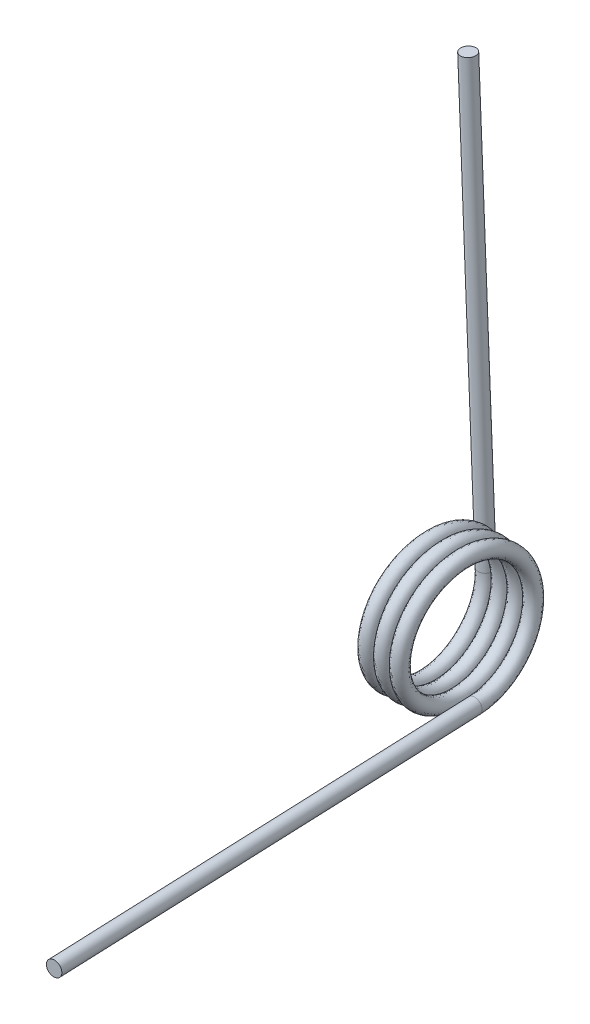
ISO-10303-21;
HEADER;
FILE_DESCRIPTION(('STEP AP214'),'2;1');
FILE_NAME('part.step','',(''),(''),'','','');
FILE_SCHEMA(('AUTOMOTIVE_DESIGN { 1 0 10303 214 1 1 1 1 }'));
ENDSEC;
DATA;
#1=APPLICATION_CONTEXT('core data for automotive mechanical design processes');
#2=APPLICATION_PROTOCOL_DEFINITION('international standard','automotive_design',2000,#1);
#3=PRODUCT_CONTEXT('',#1,'mechanical');
#4=PRODUCT('Part','Part','',(#3));
#5=PRODUCT_RELATED_PRODUCT_CATEGORY('part','',(#4));
#6=PRODUCT_DEFINITION_FORMATION('','',#4);
#7=PRODUCT_DEFINITION_CONTEXT('part definition',#1,'design');
#8=PRODUCT_DEFINITION('design','',#6,#7);
#9=PRODUCT_DEFINITION_SHAPE('','',#8);
#10=(LENGTH_UNIT() NAMED_UNIT(*) SI_UNIT(.MILLI.,.METRE.));
#11=(NAMED_UNIT(*) PLANE_ANGLE_UNIT() SI_UNIT($,.RADIAN.));
#12=(NAMED_UNIT(*) SI_UNIT($,.STERADIAN.) SOLID_ANGLE_UNIT());
#13=UNCERTAINTY_MEASURE_WITH_UNIT(LENGTH_MEASURE(1.E-05),#10,'distance_accuracy_value','');
#14=(GEOMETRIC_REPRESENTATION_CONTEXT(3) GLOBAL_UNCERTAINTY_ASSIGNED_CONTEXT((#13)) GLOBAL_UNIT_ASSIGNED_CONTEXT((#10,
#11,#12)) REPRESENTATION_CONTEXT('',''));
#15=CARTESIAN_POINT('',(0.,0.,0.));
#16=DIRECTION('',(0.,0.,1.));
#17=DIRECTION('',(1.,0.,0.));
#18=AXIS2_PLACEMENT_3D('',#15,#16,#17);
#19=CARTESIAN_POINT('',(-1.99434267543127,12.6898182038122,-1.81609999999932));
#20=DIRECTION('',(-0.0400348563331707,0.99919828376473,0.));
#21=DIRECTION('',(1.33574674451489E-12,0.,1.));
#22=AXIS2_PLACEMENT_3D('',#19,#20,#21);
#23=PLANE('',#22);
#24=CARTESIAN_POINT('',(-1.99434267543127,12.6898182038122,-1.81609999999932));
#25=DIRECTION('',(-0.0400348563331735,0.99919828376473,0.));
#26=DIRECTION('',(-0.99919828376473,-0.0400348563331735,0.));
#27=AXIS2_PLACEMENT_3D('',#24,#25,#26);
#28=CIRCLE('',#27,0.2159);
#29=CARTESIAN_POINT('',(-2.21006958489607,12.6811746783298,-1.81609999999932));
#30=VERTEX_POINT('',#29);
#31=EDGE_CURVE('E11',#30,#30,#28,.T.);
#32=ORIENTED_EDGE('',*,*,#31,.T.);
#33=EDGE_LOOP('',(#32));
#34=FACE_BOUND('',#33,.T.);
#35=ADVANCED_FACE('F17',(#34),#23,.T.);
#36=CARTESIAN_POINT('',(-1.99434267543127,12.6898182038122,-1.81609999999932));
#37=DIRECTION('',(0.0400348563331735,-0.99919828376473,0.));
#38=DIRECTION('',(0.99919828376473,0.0400348563331735,0.));
#39=AXIS2_PLACEMENT_3D('',#36,#37,#38);
#40=CYLINDRICAL_SURFACE('',#39,0.2159);
#41=ORIENTED_EDGE('',*,*,#31,.F.);
#42=EDGE_LOOP('',(#41));
#43=FACE_BOUND('',#42,.T.);
#44=CARTESIAN_POINT('',(-1.4859,0.,-1.8161));
#45=DIRECTION('',(-0.0400348563331707,0.99919828376473,0.));
#46=DIRECTION('',(-0.99919828376473,-0.0400348563331707,0.));
#47=AXIS2_PLACEMENT_3D('',#44,#45,#46);
#48=CIRCLE('',#47,0.2159);
#49=CARTESIAN_POINT('',(-1.70162690946481,-0.00864352548223333,-1.8161));
#50=VERTEX_POINT('',#49);
#51=EDGE_CURVE('E59',#50,#50,#48,.T.);
#52=ORIENTED_EDGE('',*,*,#51,.T.);
#53=EDGE_LOOP('',(#52));
#54=FACE_BOUND('',#53,.T.);
#55=ADVANCED_FACE('F19',(#43,#54),#40,.T.);
#56=CARTESIAN_POINT('',(0.508442675431268,-1.81610000000012,12.6898182038121));
#57=DIRECTION('',(0.0400348563331707,0.,0.99919828376473));
#58=DIRECTION('',(-2.47250978802037E-13,-1.,0.));
#59=AXIS2_PLACEMENT_3D('',#56,#57,#58);
#60=PLANE('',#59);
#61=CARTESIAN_POINT('',(0.508442675431268,-1.81610000000012,12.6898182038121));
#62=DIRECTION('',(0.0400348563331734,0.,0.99919828376473));
#63=DIRECTION('',(0.99919828376473,0.,-0.0400348563331734));
#64=AXIS2_PLACEMENT_3D('',#61,#62,#63);
#65=CIRCLE('',#64,0.2159);
#66=CARTESIAN_POINT('',(0.724169584896074,-1.81610000000012,12.6811746783297));
#67=VERTEX_POINT('',#66);
#68=EDGE_CURVE('E21',#67,#67,#65,.T.);
#69=ORIENTED_EDGE('',*,*,#68,.T.);
#70=EDGE_LOOP('',(#69));
#71=FACE_BOUND('',#70,.T.);
#72=ADVANCED_FACE('F97',(#71),#60,.T.);
#73=CARTESIAN_POINT('',(0.508442675431268,-1.81610000000012,12.6898182038121));
#74=DIRECTION('',(-0.0400348563331734,0.,-0.99919828376473));
#75=DIRECTION('',(-0.99919828376473,0.,0.0400348563331734));
#76=AXIS2_PLACEMENT_3D('',#73,#74,#75);
#77=CYLINDRICAL_SURFACE('',#76,0.2159);
#78=ORIENTED_EDGE('',*,*,#68,.F.);
#79=EDGE_LOOP('',(#78));
#80=FACE_BOUND('',#79,.T.);
#81=CARTESIAN_POINT('',(0.,-1.8161,0.));
#82=DIRECTION('',(0.0400348563331707,0.,0.99919828376473));
#83=DIRECTION('',(0.99919828376473,0.,-0.0400348563331707));
#84=AXIS2_PLACEMENT_3D('',#81,#82,#83);
#85=CIRCLE('',#84,0.2159);
#86=CARTESIAN_POINT('',(0.215726909464805,-1.8161,-0.00864352548234956));
#87=VERTEX_POINT('',#86);
#88=EDGE_CURVE('E55',#87,#87,#85,.T.);
#89=ORIENTED_EDGE('',*,*,#88,.T.);
#90=EDGE_LOOP('',(#89));
#91=FACE_BOUND('',#90,.T.);
#92=ADVANCED_FACE('F56',(#80,#91),#77,.T.);
#93=CARTESIAN_POINT('',(-0.215726909464805,-1.8161,0.00864352548231254));
#94=CARTESIAN_POINT('',(-0.253826909464805,-1.82109034176396,-1.03988229839297));
#95=CARTESIAN_POINT('',(-0.291926909464805,-0.915535512645941,-1.56846697307177));
#96=CARTESIAN_POINT('',(-0.330026909464805,-0.00998068352792119,-2.09705164775056));
#97=CARTESIAN_POINT('',(-0.368126909464805,0.900564487354059,-1.57711049855407));
#98=CARTESIAN_POINT('',(-0.406226909464805,1.81110965823604,-1.05716934935759));
#99=CARTESIAN_POINT('',(-0.444326909464805,1.8161,-0.00864352548231276));
#100=CARTESIAN_POINT('',(-0.482426909464805,1.82109034176396,1.03988229839297));
#101=CARTESIAN_POINT('',(-0.520526909464805,0.915535512645942,1.56846697307177));
#102=CARTESIAN_POINT('',(-0.558626909464805,0.00998068352792145,2.09705164775056));
#103=CARTESIAN_POINT('',(-0.596726909464805,-0.900564487354058,1.57711049855407));
#104=CARTESIAN_POINT('',(-0.634826909464805,-1.81110965823604,1.05716934935759));
#105=CARTESIAN_POINT('',(-0.672926909464804,-1.8161,0.00864352548231254));
#106=CARTESIAN_POINT('',(-0.711026909464805,-1.82109034176396,-1.03988229839297));
#107=CARTESIAN_POINT('',(-0.749126909464804,-0.915535512645941,-1.56846697307177));
#108=CARTESIAN_POINT('',(-0.787226909464804,-0.00998068352792119,-2.09705164775056));
#109=CARTESIAN_POINT('',(-0.825326909464804,0.900564487354059,-1.57711049855407));
#110=CARTESIAN_POINT('',(-0.863426909464804,1.81110965823604,-1.05716934935759));
#111=CARTESIAN_POINT('',(-0.901526909464804,1.8161,-0.00864352548231276));
#112=CARTESIAN_POINT('',(-0.939626909464804,1.82109034176396,1.03988229839297));
#113=CARTESIAN_POINT('',(-0.977726909464804,0.915535512645942,1.56846697307177));
#114=CARTESIAN_POINT('',(-1.0158269094648,0.00998068352792145,2.09705164775056));
#115=CARTESIAN_POINT('',(-1.0539269094648,-0.900564487354058,1.57711049855407));
#116=CARTESIAN_POINT('',(-1.0920269094648,-1.81110965823604,1.05716934935759));
#117=CARTESIAN_POINT('',(-1.1301269094648,-1.8161,0.00864352548231254));
#118=CARTESIAN_POINT('',(-1.1682269094648,-1.82109034176396,-1.03988229839297));
#119=CARTESIAN_POINT('',(-1.2063269094648,-0.915535512645941,-1.56846697307177));
#120=CARTESIAN_POINT('',(-1.2444269094648,-0.00998068352792119,-2.09705164775056));
#121=CARTESIAN_POINT('',(-1.2825269094648,0.900564487354059,-1.57711049855407));
#122=CARTESIAN_POINT('',(-1.3206269094648,1.81110965823604,-1.05716934935759));
#123=CARTESIAN_POINT('',(-1.3587269094648,1.8161,-0.00864352548231276));
#124=CARTESIAN_POINT('',(-1.3968269094648,1.82109034176396,1.03988229839297));
#125=CARTESIAN_POINT('',(-1.4349269094648,0.915535512645942,1.56846697307177));
#126=CARTESIAN_POINT('',(-1.4730269094648,0.00998068352792145,2.09705164775056));
#127=CARTESIAN_POINT('',(-1.51112690946481,-0.900564487354058,1.57711049855407));
#128=CARTESIAN_POINT('',(-1.5492269094648,-1.81110965823604,1.05716934935759));
#129=CARTESIAN_POINT('',(-1.5873269094648,-1.8161,0.00864352548231254));
#130=CARTESIAN_POINT('',(-1.6254269094648,-1.82109034176396,-1.03988229839297));
#131=CARTESIAN_POINT('',(-1.6635269094648,-0.915535512645941,-1.56846697307177));
#132=CARTESIAN_POINT('',(-1.7016269094648,-0.00998068352792119,-2.09705164775056));
#133=CARTESIAN_POINT('',(-1.7397269094648,0.900564487354059,-1.57711049855407));
#134=CARTESIAN_POINT('',(-1.7778269094648,1.81110965823604,-1.05716934935759));
#135=CARTESIAN_POINT('',(-1.8159269094648,1.8161,-0.00864352548231276));
#136=CARTESIAN_POINT('',(-1.8540269094648,1.82109034176396,1.03988229839297));
#137=CARTESIAN_POINT('',(-1.8921269094648,0.915535512645942,1.56846697307177));
#138=CARTESIAN_POINT('',(-1.9302269094648,0.00998068352792145,2.09705164775056));
#139=CARTESIAN_POINT('',(-1.9683269094648,-0.900564487354058,1.57711049855407));
#140=CARTESIAN_POINT('',(-2.0064269094648,-1.81110965823604,1.05716934935759));
#141=CARTESIAN_POINT('',(-2.0445269094648,-1.8161,0.00864352548231254));
#142=CARTESIAN_POINT('',(-0.215726909464805,-1.3843,0.00864352548231681));
#143=CARTESIAN_POINT('',(-0.253826909464805,-1.38929034176396,-0.790582452156881));
#144=CARTESIAN_POINT('',(-0.291926909464805,-0.699635512645945,-1.19451720371764));
#145=CARTESIAN_POINT('',(-0.330026909464805,-0.0099806835279261,-1.5984519552784));
#146=CARTESIAN_POINT('',(-0.368126909464805,0.684664487354054,-1.20316072919996));
#147=CARTESIAN_POINT('',(-0.406226909464805,1.37930965823604,-0.807869503121517));
#148=CARTESIAN_POINT('',(-0.444326909464805,1.3843,-0.00864352548231697));
#149=CARTESIAN_POINT('',(-0.482426909464804,1.38929034176396,0.790582452156881));
#150=CARTESIAN_POINT('',(-0.520526909464804,0.699635512645945,1.19451720371764));
#151=CARTESIAN_POINT('',(-0.558626909464803,0.00998068352792629,1.5984519552784));
#152=CARTESIAN_POINT('',(-0.596726909464804,-0.684664487354054,1.20316072919996));
#153=CARTESIAN_POINT('',(-0.634826909464804,-1.37930965823604,0.807869503121517));
#154=CARTESIAN_POINT('',(-0.672926909464804,-1.3843,0.00864352548231681));
#155=CARTESIAN_POINT('',(-0.711026909464803,-1.38929034176396,-0.790582452156881));
#156=CARTESIAN_POINT('',(-0.749126909464804,-0.699635512645945,-1.19451720371764));
#157=CARTESIAN_POINT('',(-0.787226909464804,-0.0099806835279261,-1.5984519552784));
#158=CARTESIAN_POINT('',(-0.825326909464804,0.684664487354054,-1.20316072919996));
#159=CARTESIAN_POINT('',(-0.863426909464803,1.37930965823604,-0.807869503121517));
#160=CARTESIAN_POINT('',(-0.901526909464804,1.3843,-0.00864352548231697));
#161=CARTESIAN_POINT('',(-0.939626909464804,1.38929034176396,0.790582452156881));
#162=CARTESIAN_POINT('',(-0.977726909464802,0.699635512645945,1.19451720371764));
#163=CARTESIAN_POINT('',(-1.0158269094648,0.00998068352792629,1.5984519552784));
#164=CARTESIAN_POINT('',(-1.0539269094648,-0.684664487354054,1.20316072919996));
#165=CARTESIAN_POINT('',(-1.0920269094648,-1.37930965823604,0.807869503121517));
#166=CARTESIAN_POINT('',(-1.1301269094648,-1.3843,0.00864352548231681));
#167=CARTESIAN_POINT('',(-1.1682269094648,-1.38929034176396,-0.790582452156881));
#168=CARTESIAN_POINT('',(-1.2063269094648,-0.699635512645945,-1.19451720371764));
#169=CARTESIAN_POINT('',(-1.2444269094648,-0.0099806835279261,-1.5984519552784));
#170=CARTESIAN_POINT('',(-1.2825269094648,0.684664487354054,-1.20316072919996));
#171=CARTESIAN_POINT('',(-1.3206269094648,1.37930965823604,-0.807869503121517));
#172=CARTESIAN_POINT('',(-1.3587269094648,1.3843,-0.00864352548231697));
#173=CARTESIAN_POINT('',(-1.3968269094648,1.38929034176396,0.790582452156881));
#174=CARTESIAN_POINT('',(-1.4349269094648,0.699635512645945,1.19451720371764));
#175=CARTESIAN_POINT('',(-1.4730269094648,0.00998068352792629,1.5984519552784));
#176=CARTESIAN_POINT('',(-1.5111269094648,-0.684664487354054,1.20316072919996));
#177=CARTESIAN_POINT('',(-1.5492269094648,-1.37930965823604,0.807869503121517));
#178=CARTESIAN_POINT('',(-1.5873269094648,-1.3843,0.00864352548231681));
#179=CARTESIAN_POINT('',(-1.6254269094648,-1.38929034176396,-0.790582452156881));
#180=CARTESIAN_POINT('',(-1.6635269094648,-0.699635512645945,-1.19451720371764));
#181=CARTESIAN_POINT('',(-1.7016269094648,-0.0099806835279261,-1.5984519552784));
#182=CARTESIAN_POINT('',(-1.7397269094648,0.684664487354054,-1.20316072919996));
#183=CARTESIAN_POINT('',(-1.7778269094648,1.37930965823604,-0.807869503121517));
#184=CARTESIAN_POINT('',(-1.8159269094648,1.3843,-0.00864352548231697));
#185=CARTESIAN_POINT('',(-1.8540269094648,1.38929034176396,0.790582452156881));
#186=CARTESIAN_POINT('',(-1.8921269094648,0.699635512645945,1.19451720371764));
#187=CARTESIAN_POINT('',(-1.9302269094648,0.00998068352792629,1.5984519552784));
#188=CARTESIAN_POINT('',(-1.9683269094648,-0.684664487354054,1.20316072919996));
#189=CARTESIAN_POINT('',(-2.0064269094648,-1.37930965823604,0.807869503121517));
#190=CARTESIAN_POINT('',(-2.0445269094648,-1.3843,0.00864352548231681));
#191=CARTESIAN_POINT('',(0.215726909464805,-1.3843,-0.00864352548234631));
#192=CARTESIAN_POINT('',(0.177626909464806,-1.37930965823602,-0.807869503121544));
#193=CARTESIAN_POINT('',(0.139526909464806,-0.684664487354029,-1.20316072919997));
#194=CARTESIAN_POINT('',(0.101426909464806,0.00998068352795996,-1.5984519552784));
#195=CARTESIAN_POINT('',(0.0633269094648058,0.699635512645969,-1.19451720371762));
#196=CARTESIAN_POINT('',(0.0252269094648059,1.38929034176398,-0.790582452156854));
#197=CARTESIAN_POINT('',(-0.012873090535194,1.3843,0.00864352548234613));
#198=CARTESIAN_POINT('',(-0.0509730905351939,1.37930965823602,0.807869503121544));
#199=CARTESIAN_POINT('',(-0.0890730905351938,0.684664487354031,1.20316072919997));
#200=CARTESIAN_POINT('',(-0.127173090535194,-0.00998068352795977,1.5984519552784));
#201=CARTESIAN_POINT('',(-0.165273090535194,-0.699635512645969,1.19451720371763));
#202=CARTESIAN_POINT('',(-0.203373090535194,-1.38929034176398,0.790582452156854));
#203=CARTESIAN_POINT('',(-0.241473090535193,-1.3843,-0.00864352548234631));
#204=CARTESIAN_POINT('',(-0.279573090535193,-1.37930965823602,-0.807869503121544));
#205=CARTESIAN_POINT('',(-0.317673090535193,-0.684664487354029,-1.20316072919997));
#206=CARTESIAN_POINT('',(-0.355773090535193,0.00998068352795996,-1.5984519552784));
#207=CARTESIAN_POINT('',(-0.393873090535193,0.699635512645969,-1.19451720371762));
#208=CARTESIAN_POINT('',(-0.431973090535193,1.38929034176398,-0.790582452156854));
#209=CARTESIAN_POINT('',(-0.470073090535192,1.3843,0.00864352548234613));
#210=CARTESIAN_POINT('',(-0.508173090535193,1.37930965823602,0.807869503121544));
#211=CARTESIAN_POINT('',(-0.546273090535192,0.684664487354031,1.20316072919997));
#212=CARTESIAN_POINT('',(-0.584373090535192,-0.00998068352795977,1.5984519552784));
#213=CARTESIAN_POINT('',(-0.622473090535192,-0.699635512645969,1.19451720371763));
#214=CARTESIAN_POINT('',(-0.660573090535191,-1.38929034176398,0.790582452156854));
#215=CARTESIAN_POINT('',(-0.698673090535192,-1.3843,-0.00864352548234631));
#216=CARTESIAN_POINT('',(-0.736773090535192,-1.37930965823602,-0.807869503121544));
#217=CARTESIAN_POINT('',(-0.774873090535192,-0.684664487354029,-1.20316072919997));
#218=CARTESIAN_POINT('',(-0.812973090535192,0.00998068352795996,-1.5984519552784));
#219=CARTESIAN_POINT('',(-0.851073090535192,0.699635512645969,-1.19451720371762));
#220=CARTESIAN_POINT('',(-0.889173090535192,1.38929034176398,-0.790582452156854));
#221=CARTESIAN_POINT('',(-0.927273090535192,1.3843,0.00864352548234613));
#222=CARTESIAN_POINT('',(-0.965373090535191,1.37930965823602,0.807869503121544));
#223=CARTESIAN_POINT('',(-1.00347309053519,0.684664487354031,1.20316072919997));
#224=CARTESIAN_POINT('',(-1.04157309053519,-0.00998068352795977,1.5984519552784));
#225=CARTESIAN_POINT('',(-1.07967309053519,-0.699635512645969,1.19451720371763));
#226=CARTESIAN_POINT('',(-1.11777309053519,-1.38929034176398,0.790582452156854));
#227=CARTESIAN_POINT('',(-1.15587309053519,-1.3843,-0.00864352548234631));
#228=CARTESIAN_POINT('',(-1.19397309053519,-1.37930965823602,-0.807869503121544));
#229=CARTESIAN_POINT('',(-1.23207309053519,-0.684664487354029,-1.20316072919997));
#230=CARTESIAN_POINT('',(-1.27017309053519,0.00998068352795996,-1.5984519552784));
#231=CARTESIAN_POINT('',(-1.30827309053519,0.699635512645969,-1.19451720371762));
#232=CARTESIAN_POINT('',(-1.34637309053519,1.38929034176398,-0.790582452156854));
#233=CARTESIAN_POINT('',(-1.38447309053519,1.3843,0.00864352548234613));
#234=CARTESIAN_POINT('',(-1.42257309053519,1.37930965823602,0.807869503121544));
#235=CARTESIAN_POINT('',(-1.46067309053519,0.684664487354031,1.20316072919997));
#236=CARTESIAN_POINT('',(-1.49877309053519,-0.00998068352795977,1.5984519552784));
#237=CARTESIAN_POINT('',(-1.53687309053519,-0.699635512645969,1.19451720371763));
#238=CARTESIAN_POINT('',(-1.57497309053519,-1.38929034176398,0.790582452156854));
#239=CARTESIAN_POINT('',(-1.61307309053519,-1.3843,-0.00864352548234631));
#240=CARTESIAN_POINT('',(0.215726909464805,-1.8161,-0.00864352548235058));
#241=CARTESIAN_POINT('',(0.177626909464805,-1.81110965823602,-1.05716934935763));
#242=CARTESIAN_POINT('',(0.139526909464805,-0.900564487354027,-1.57711049855409));
#243=CARTESIAN_POINT('',(0.101426909464806,0.00998068352796487,-2.09705164775056));
#244=CARTESIAN_POINT('',(0.0633269094648057,0.915535512645973,-1.56846697307174));
#245=CARTESIAN_POINT('',(0.0252269094648058,1.82109034176398,-1.03988229839293));
#246=CARTESIAN_POINT('',(-0.0128730905351941,1.8161,0.00864352548235036));
#247=CARTESIAN_POINT('',(-0.0509730905351941,1.81110965823602,1.05716934935763));
#248=CARTESIAN_POINT('',(-0.089073090535194,0.900564487354027,1.57711049855409));
#249=CARTESIAN_POINT('',(-0.127173090535194,-0.00998068352796461,2.09705164775056));
#250=CARTESIAN_POINT('',(-0.165273090535194,-0.915535512645973,1.56846697307174));
#251=CARTESIAN_POINT('',(-0.203373090535194,-1.82109034176398,1.03988229839293));
#252=CARTESIAN_POINT('',(-0.241473090535194,-1.8161,-0.00864352548235058));
#253=CARTESIAN_POINT('',(-0.279573090535194,-1.81110965823602,-1.05716934935763));
#254=CARTESIAN_POINT('',(-0.317673090535194,-0.900564487354027,-1.57711049855409));
#255=CARTESIAN_POINT('',(-0.355773090535193,0.00998068352796487,-2.09705164775056));
#256=CARTESIAN_POINT('',(-0.393873090535194,0.915535512645973,-1.56846697307174));
#257=CARTESIAN_POINT('',(-0.431973090535193,1.82109034176398,-1.03988229839293));
#258=CARTESIAN_POINT('',(-0.470073090535193,1.8161,0.00864352548235036));
#259=CARTESIAN_POINT('',(-0.508173090535193,1.81110965823602,1.05716934935763));
#260=CARTESIAN_POINT('',(-0.546273090535193,0.900564487354027,1.57711049855409));
#261=CARTESIAN_POINT('',(-0.584373090535193,-0.00998068352796461,2.09705164775056));
#262=CARTESIAN_POINT('',(-0.622473090535193,-0.915535512645973,1.56846697307174));
#263=CARTESIAN_POINT('',(-0.660573090535193,-1.82109034176398,1.03988229839293));
#264=CARTESIAN_POINT('',(-0.698673090535193,-1.8161,-0.00864352548235058));
#265=CARTESIAN_POINT('',(-0.736773090535192,-1.81110965823602,-1.05716934935763));
#266=CARTESIAN_POINT('',(-0.774873090535192,-0.900564487354027,-1.57711049855409));
#267=CARTESIAN_POINT('',(-0.812973090535192,0.00998068352796487,-2.09705164775056));
#268=CARTESIAN_POINT('',(-0.851073090535192,0.915535512645973,-1.56846697307174));
#269=CARTESIAN_POINT('',(-0.889173090535192,1.82109034176398,-1.03988229839293));
#270=CARTESIAN_POINT('',(-0.927273090535192,1.8161,0.00864352548235036));
#271=CARTESIAN_POINT('',(-0.965373090535192,1.81110965823602,1.05716934935763));
#272=CARTESIAN_POINT('',(-1.00347309053519,0.900564487354027,1.57711049855409));
#273=CARTESIAN_POINT('',(-1.04157309053519,-0.00998068352796461,2.09705164775056));
#274=CARTESIAN_POINT('',(-1.07967309053519,-0.915535512645973,1.56846697307174));
#275=CARTESIAN_POINT('',(-1.11777309053519,-1.82109034176398,1.03988229839293));
#276=CARTESIAN_POINT('',(-1.15587309053519,-1.8161,-0.00864352548235058));
#277=CARTESIAN_POINT('',(-1.19397309053519,-1.81110965823602,-1.05716934935763));
#278=CARTESIAN_POINT('',(-1.23207309053519,-0.900564487354027,-1.57711049855409));
#279=CARTESIAN_POINT('',(-1.27017309053519,0.00998068352796487,-2.09705164775056));
#280=CARTESIAN_POINT('',(-1.30827309053519,0.915535512645973,-1.56846697307174));
#281=CARTESIAN_POINT('',(-1.34637309053519,1.82109034176398,-1.03988229839293));
#282=CARTESIAN_POINT('',(-1.38447309053519,1.8161,0.00864352548235036));
#283=CARTESIAN_POINT('',(-1.42257309053519,1.81110965823602,1.05716934935763));
#284=CARTESIAN_POINT('',(-1.46067309053519,0.900564487354027,1.57711049855409));
#285=CARTESIAN_POINT('',(-1.49877309053519,-0.00998068352796461,2.09705164775056));
#286=CARTESIAN_POINT('',(-1.53687309053519,-0.915535512645973,1.56846697307174));
#287=CARTESIAN_POINT('',(-1.57497309053519,-1.82109034176398,1.03988229839293));
#288=CARTESIAN_POINT('',(-1.61307309053519,-1.8161,-0.00864352548235058));
#289=CARTESIAN_POINT('',(0.215726909464805,-2.2479,-0.00864352548235486));
#290=CARTESIAN_POINT('',(0.177626909464805,-2.24290965823602,-1.30646919559371));
#291=CARTESIAN_POINT('',(0.139526909464805,-1.11646448735402,-1.95106026790822));
#292=CARTESIAN_POINT('',(0.101426909464806,0.00998068352796977,-2.59565134022272));
#293=CARTESIAN_POINT('',(0.0633269094648055,1.13143551264598,-1.94241674242586));
#294=CARTESIAN_POINT('',(0.0252269094648057,2.25289034176399,-1.28918214462901));
#295=CARTESIAN_POINT('',(-0.0128730905351942,2.2479,0.00864352548235458));
#296=CARTESIAN_POINT('',(-0.0509730905351942,2.24290965823602,1.30646919559371));
#297=CARTESIAN_POINT('',(-0.0890730905351941,1.11646448735402,1.95106026790821));
#298=CARTESIAN_POINT('',(-0.127173090535194,-0.00998068352796945,2.59565134022272));
#299=CARTESIAN_POINT('',(-0.165273090535194,-1.13143551264598,1.94241674242586));
#300=CARTESIAN_POINT('',(-0.203373090535194,-2.25289034176398,1.28918214462901));
#301=CARTESIAN_POINT('',(-0.241473090535194,-2.2479,-0.00864352548235486));
#302=CARTESIAN_POINT('',(-0.279573090535193,-2.24290965823602,-1.30646919559371));
#303=CARTESIAN_POINT('',(-0.317673090535194,-1.11646448735402,-1.95106026790822));
#304=CARTESIAN_POINT('',(-0.355773090535193,0.00998068352796977,-2.59565134022272));
#305=CARTESIAN_POINT('',(-0.393873090535193,1.13143551264598,-1.94241674242586));
#306=CARTESIAN_POINT('',(-0.431973090535193,2.25289034176399,-1.28918214462901));
#307=CARTESIAN_POINT('',(-0.470073090535192,2.2479,0.00864352548235458));
#308=CARTESIAN_POINT('',(-0.508173090535193,2.24290965823602,1.30646919559371));
#309=CARTESIAN_POINT('',(-0.546273090535192,1.11646448735402,1.95106026790821));
#310=CARTESIAN_POINT('',(-0.584373090535192,-0.00998068352796945,2.59565134022272));
#311=CARTESIAN_POINT('',(-0.622473090535192,-1.13143551264598,1.94241674242586));
#312=CARTESIAN_POINT('',(-0.660573090535193,-2.25289034176398,1.28918214462901));
#313=CARTESIAN_POINT('',(-0.698673090535192,-2.2479,-0.00864352548235486));
#314=CARTESIAN_POINT('',(-0.736773090535192,-2.24290965823602,-1.30646919559371));
#315=CARTESIAN_POINT('',(-0.774873090535192,-1.11646448735402,-1.95106026790822));
#316=CARTESIAN_POINT('',(-0.812973090535192,0.00998068352796977,-2.59565134022272));
#317=CARTESIAN_POINT('',(-0.851073090535192,1.13143551264598,-1.94241674242586));
#318=CARTESIAN_POINT('',(-0.889173090535192,2.25289034176399,-1.28918214462901));
#319=CARTESIAN_POINT('',(-0.927273090535192,2.2479,0.00864352548235458));
#320=CARTESIAN_POINT('',(-0.965373090535191,2.24290965823602,1.30646919559371));
#321=CARTESIAN_POINT('',(-1.00347309053519,1.11646448735402,1.95106026790821));
#322=CARTESIAN_POINT('',(-1.04157309053519,-0.00998068352796945,2.59565134022272));
#323=CARTESIAN_POINT('',(-1.07967309053519,-1.13143551264598,1.94241674242586));
#324=CARTESIAN_POINT('',(-1.11777309053519,-2.25289034176398,1.28918214462901));
#325=CARTESIAN_POINT('',(-1.15587309053519,-2.2479,-0.00864352548235486));
#326=CARTESIAN_POINT('',(-1.19397309053519,-2.24290965823602,-1.30646919559371));
#327=CARTESIAN_POINT('',(-1.23207309053519,-1.11646448735402,-1.95106026790822));
#328=CARTESIAN_POINT('',(-1.27017309053519,0.00998068352796977,-2.59565134022272));
#329=CARTESIAN_POINT('',(-1.30827309053519,1.13143551264598,-1.94241674242586));
#330=CARTESIAN_POINT('',(-1.34637309053519,2.25289034176399,-1.28918214462901));
#331=CARTESIAN_POINT('',(-1.38447309053519,2.2479,0.00864352548235458));
#332=CARTESIAN_POINT('',(-1.42257309053519,2.24290965823602,1.30646919559371));
#333=CARTESIAN_POINT('',(-1.46067309053519,1.11646448735402,1.95106026790821));
#334=CARTESIAN_POINT('',(-1.49877309053519,-0.00998068352796945,2.59565134022272));
#335=CARTESIAN_POINT('',(-1.53687309053519,-1.13143551264598,1.94241674242586));
#336=CARTESIAN_POINT('',(-1.57497309053519,-2.25289034176398,1.28918214462901));
#337=CARTESIAN_POINT('',(-1.61307309053519,-2.2479,-0.00864352548235486));
#338=CARTESIAN_POINT('',(-0.215726909464806,-2.2479,0.00864352548230827));
#339=CARTESIAN_POINT('',(-0.253826909464805,-2.25289034176396,-1.28918214462905));
#340=CARTESIAN_POINT('',(-0.291926909464805,-1.13143551264594,-1.94241674242588));
#341=CARTESIAN_POINT('',(-0.330026909464805,-0.0099806835279163,-2.59565134022272));
#342=CARTESIAN_POINT('',(-0.368126909464805,1.11646448735406,-1.95106026790819));
#343=CARTESIAN_POINT('',(-0.406226909464805,2.24290965823604,-1.30646919559367));
#344=CARTESIAN_POINT('',(-0.444326909464805,2.2479,-0.00864352548230854));
#345=CARTESIAN_POINT('',(-0.482426909464805,2.25289034176396,1.28918214462905));
#346=CARTESIAN_POINT('',(-0.520526909464804,1.13143551264594,1.94241674242588));
#347=CARTESIAN_POINT('',(-0.558626909464805,0.00998068352791661,2.59565134022272));
#348=CARTESIAN_POINT('',(-0.596726909464804,-1.11646448735406,1.95106026790819));
#349=CARTESIAN_POINT('',(-0.634826909464804,-2.24290965823604,1.30646919559367));
#350=CARTESIAN_POINT('',(-0.672926909464804,-2.2479,0.00864352548230827));
#351=CARTESIAN_POINT('',(-0.711026909464803,-2.25289034176396,-1.28918214462905));
#352=CARTESIAN_POINT('',(-0.749126909464804,-1.13143551264594,-1.94241674242588));
#353=CARTESIAN_POINT('',(-0.787226909464804,-0.0099806835279163,-2.59565134022272));
#354=CARTESIAN_POINT('',(-0.825326909464804,1.11646448735406,-1.95106026790819));
#355=CARTESIAN_POINT('',(-0.863426909464803,2.24290965823604,-1.30646919559367));
#356=CARTESIAN_POINT('',(-0.901526909464804,2.2479,-0.00864352548230854));
#357=CARTESIAN_POINT('',(-0.939626909464804,2.25289034176396,1.28918214462905));
#358=CARTESIAN_POINT('',(-0.977726909464804,1.13143551264594,1.94241674242588));
#359=CARTESIAN_POINT('',(-1.0158269094648,0.00998068352791661,2.59565134022272));
#360=CARTESIAN_POINT('',(-1.0539269094648,-1.11646448735406,1.95106026790819));
#361=CARTESIAN_POINT('',(-1.0920269094648,-2.24290965823604,1.30646919559367));
#362=CARTESIAN_POINT('',(-1.1301269094648,-2.2479,0.00864352548230827));
#363=CARTESIAN_POINT('',(-1.1682269094648,-2.25289034176396,-1.28918214462905));
#364=CARTESIAN_POINT('',(-1.2063269094648,-1.13143551264594,-1.94241674242588));
#365=CARTESIAN_POINT('',(-1.2444269094648,-0.0099806835279163,-2.59565134022272));
#366=CARTESIAN_POINT('',(-1.2825269094648,1.11646448735406,-1.95106026790819));
#367=CARTESIAN_POINT('',(-1.3206269094648,2.24290965823604,-1.30646919559367));
#368=CARTESIAN_POINT('',(-1.3587269094648,2.2479,-0.00864352548230854));
#369=CARTESIAN_POINT('',(-1.3968269094648,2.25289034176396,1.28918214462905));
#370=CARTESIAN_POINT('',(-1.4349269094648,1.13143551264594,1.94241674242588));
#371=CARTESIAN_POINT('',(-1.4730269094648,0.00998068352791661,2.59565134022272));
#372=CARTESIAN_POINT('',(-1.5111269094648,-1.11646448735406,1.95106026790819));
#373=CARTESIAN_POINT('',(-1.5492269094648,-2.24290965823604,1.30646919559367));
#374=CARTESIAN_POINT('',(-1.5873269094648,-2.2479,0.00864352548230827));
#375=CARTESIAN_POINT('',(-1.6254269094648,-2.25289034176396,-1.28918214462905));
#376=CARTESIAN_POINT('',(-1.6635269094648,-1.13143551264594,-1.94241674242588));
#377=CARTESIAN_POINT('',(-1.7016269094648,-0.0099806835279163,-2.59565134022272));
#378=CARTESIAN_POINT('',(-1.7397269094648,1.11646448735406,-1.95106026790819));
#379=CARTESIAN_POINT('',(-1.7778269094648,2.24290965823604,-1.30646919559367));
#380=CARTESIAN_POINT('',(-1.8159269094648,2.2479,-0.00864352548230854));
#381=CARTESIAN_POINT('',(-1.8540269094648,2.25289034176396,1.28918214462905));
#382=CARTESIAN_POINT('',(-1.8921269094648,1.13143551264594,1.94241674242588));
#383=CARTESIAN_POINT('',(-1.9302269094648,0.00998068352791661,2.59565134022272));
#384=CARTESIAN_POINT('',(-1.9683269094648,-1.11646448735406,1.95106026790819));
#385=CARTESIAN_POINT('',(-2.0064269094648,-2.24290965823604,1.30646919559367));
#386=CARTESIAN_POINT('',(-2.0445269094648,-2.2479,0.00864352548230827));
#387=CARTESIAN_POINT('',(-0.215726909464805,-1.8161,0.00864352548231254));
#388=CARTESIAN_POINT('',(-0.253826909464805,-1.82109034176396,-1.03988229839297));
#389=CARTESIAN_POINT('',(-0.291926909464805,-0.915535512645941,-1.56846697307177));
#390=CARTESIAN_POINT('',(-0.330026909464805,-0.00998068352792119,-2.09705164775056));
#391=CARTESIAN_POINT('',(-0.368126909464805,0.900564487354059,-1.57711049855407));
#392=CARTESIAN_POINT('',(-0.406226909464805,1.81110965823604,-1.05716934935759));
#393=CARTESIAN_POINT('',(-0.444326909464805,1.8161,-0.00864352548231276));
#394=CARTESIAN_POINT('',(-0.482426909464805,1.82109034176396,1.03988229839297));
#395=CARTESIAN_POINT('',(-0.520526909464805,0.915535512645942,1.56846697307177));
#396=CARTESIAN_POINT('',(-0.558626909464805,0.00998068352792145,2.09705164775056));
#397=CARTESIAN_POINT('',(-0.596726909464805,-0.900564487354058,1.57711049855407));
#398=CARTESIAN_POINT('',(-0.634826909464805,-1.81110965823604,1.05716934935759));
#399=CARTESIAN_POINT('',(-0.672926909464804,-1.8161,0.00864352548231254));
#400=CARTESIAN_POINT('',(-0.711026909464805,-1.82109034176396,-1.03988229839297));
#401=CARTESIAN_POINT('',(-0.749126909464804,-0.915535512645941,-1.56846697307177));
#402=CARTESIAN_POINT('',(-0.787226909464804,-0.00998068352792119,-2.09705164775056));
#403=CARTESIAN_POINT('',(-0.825326909464804,0.900564487354059,-1.57711049855407));
#404=CARTESIAN_POINT('',(-0.863426909464804,1.81110965823604,-1.05716934935759));
#405=CARTESIAN_POINT('',(-0.901526909464804,1.8161,-0.00864352548231276));
#406=CARTESIAN_POINT('',(-0.939626909464804,1.82109034176396,1.03988229839297));
#407=CARTESIAN_POINT('',(-0.977726909464804,0.915535512645942,1.56846697307177));
#408=CARTESIAN_POINT('',(-1.0158269094648,0.00998068352792145,2.09705164775056));
#409=CARTESIAN_POINT('',(-1.0539269094648,-0.900564487354058,1.57711049855407));
#410=CARTESIAN_POINT('',(-1.0920269094648,-1.81110965823604,1.05716934935759));
#411=CARTESIAN_POINT('',(-1.1301269094648,-1.8161,0.00864352548231254));
#412=CARTESIAN_POINT('',(-1.1682269094648,-1.82109034176396,-1.03988229839297));
#413=CARTESIAN_POINT('',(-1.2063269094648,-0.915535512645941,-1.56846697307177));
#414=CARTESIAN_POINT('',(-1.2444269094648,-0.00998068352792119,-2.09705164775056));
#415=CARTESIAN_POINT('',(-1.2825269094648,0.900564487354059,-1.57711049855407));
#416=CARTESIAN_POINT('',(-1.3206269094648,1.81110965823604,-1.05716934935759));
#417=CARTESIAN_POINT('',(-1.3587269094648,1.8161,-0.00864352548231276));
#418=CARTESIAN_POINT('',(-1.3968269094648,1.82109034176396,1.03988229839297));
#419=CARTESIAN_POINT('',(-1.4349269094648,0.915535512645942,1.56846697307177));
#420=CARTESIAN_POINT('',(-1.4730269094648,0.00998068352792145,2.09705164775056));
#421=CARTESIAN_POINT('',(-1.51112690946481,-0.900564487354058,1.57711049855407));
#422=CARTESIAN_POINT('',(-1.5492269094648,-1.81110965823604,1.05716934935759));
#423=CARTESIAN_POINT('',(-1.5873269094648,-1.8161,0.00864352548231254));
#424=CARTESIAN_POINT('',(-1.6254269094648,-1.82109034176396,-1.03988229839297));
#425=CARTESIAN_POINT('',(-1.6635269094648,-0.915535512645941,-1.56846697307177));
#426=CARTESIAN_POINT('',(-1.7016269094648,-0.00998068352792119,-2.09705164775056));
#427=CARTESIAN_POINT('',(-1.7397269094648,0.900564487354059,-1.57711049855407));
#428=CARTESIAN_POINT('',(-1.7778269094648,1.81110965823604,-1.05716934935759));
#429=CARTESIAN_POINT('',(-1.8159269094648,1.8161,-0.00864352548231276));
#430=CARTESIAN_POINT('',(-1.8540269094648,1.82109034176396,1.03988229839297));
#431=CARTESIAN_POINT('',(-1.8921269094648,0.915535512645942,1.56846697307177));
#432=CARTESIAN_POINT('',(-1.9302269094648,0.00998068352792145,2.09705164775056));
#433=CARTESIAN_POINT('',(-1.9683269094648,-0.900564487354058,1.57711049855407));
#434=CARTESIAN_POINT('',(-2.0064269094648,-1.81110965823604,1.05716934935759));
#435=CARTESIAN_POINT('',(-2.0445269094648,-1.8161,0.00864352548231254));
#436=(BOUNDED_SURFACE() B_SPLINE_SURFACE(3,2,((#93,#94,#95,#96,#97,#98,#99,#100,#101,#102,#103,
#104,#105,#106,#107,#108,#109,#110,#111,#112,#113,#114,#115,#116,#117,#118,#119,#120,#121,#122,
#123,#124,#125,#126,#127,#128,#129,#130,#131,#132,#133,#134,#135,#136,#137,#138,#139,#140,#141),
(#142,#143,#144,#145,#146,#147,#148,#149,#150,#151,#152,#153,#154,#155,#156,#157,#158,#159,#160,
#161,#162,#163,#164,#165,#166,#167,#168,#169,#170,#171,#172,#173,#174,#175,#176,#177,#178,#179,
#180,#181,#182,#183,#184,#185,#186,#187,#188,#189,#190),(#191,#192,#193,#194,#195,#196,#197,
#198,#199,#200,#201,#202,#203,#204,#205,#206,#207,#208,#209,#210,#211,#212,#213,#214,#215,#216,
#217,#218,#219,#220,#221,#222,#223,#224,#225,#226,#227,#228,#229,#230,#231,#232,#233,#234,#235,
#236,#237,#238,#239),(#240,#241,#242,#243,#244,#245,#246,#247,#248,#249,#250,#251,#252,#253,
#254,#255,#256,#257,#258,#259,#260,#261,#262,#263,#264,#265,#266,#267,#268,#269,#270,#271,#272,
#273,#274,#275,#276,#277,#278,#279,#280,#281,#282,#283,#284,#285,#286,#287,#288),(#289,#290,
#291,#292,#293,#294,#295,#296,#297,#298,#299,#300,#301,#302,#303,#304,#305,#306,#307,#308,#309,
#310,#311,#312,#313,#314,#315,#316,#317,#318,#319,#320,#321,#322,#323,#324,#325,#326,#327,#328,
#329,#330,#331,#332,#333,#334,#335,#336,#337),(#338,#339,#340,#341,#342,#343,#344,#345,#346,
#347,#348,#349,#350,#351,#352,#353,#354,#355,#356,#357,#358,#359,#360,#361,#362,#363,#364,#365,
#366,#367,#368,#369,#370,#371,#372,#373,#374,#375,#376,#377,#378,#379,#380,#381,#382,#383,#384,
#385,#386),(#387,#388,#389,#390,#391,#392,#393,#394,#395,#396,#397,#398,#399,#400,#401,#402,
#403,#404,#405,#406,#407,#408,#409,#410,#411,#412,#413,#414,#415,#416,#417,#418,#419,#420,#421,
#422,#423,#424,#425,#426,#427,#428,#429,#430,#431,#432,#433,#434,#435)),.UNSPECIFIED.,.T.,.F.,
.F.) B_SPLINE_SURFACE_WITH_KNOTS((4,3,4),(3,2,2,2,2,2,2,2,2,2,2,2,2,2,2,2,2,2,2,2,2,2,2,2,3),
(0.,0.5,1.),(0.,0.0416666666666667,0.0833333333333333,0.125,0.166666666666667,0.208333333333334,
0.25,0.291666666666667,0.333333333333334,0.375,0.416666666666667,0.458333333333333,0.5,
0.541666666666667,0.583333333333333,0.625,0.666666666666667,0.708333333333333,0.75,
0.791666666666667,0.833333333333333,0.875,0.916666666666667,0.958333333333333,1.),
.UNSPECIFIED.) GEOMETRIC_REPRESENTATION_ITEM() RATIONAL_B_SPLINE_SURFACE(((1.,0.866025403784439,
1.,0.866025403784439,1.,0.866025403784439,1.,0.866025403784439,1.,0.866025403784439,1.,
0.866025403784439,1.,0.866025403784439,1.,0.866025403784439,1.,0.866025403784439,1.,
0.866025403784439,1.,0.866025403784439,1.,0.866025403784439,1.,0.866025403784439,1.,
0.866025403784439,1.,0.866025403784439,1.,0.866025403784439,1.,0.866025403784439,1.,
0.866025403784439,1.,0.866025403784439,1.,0.866025403784439,1.,0.866025403784439,1.,
0.866025403784439,1.,0.866025403784439,1.,0.866025403784439,1.),(0.333333333333334,
0.288675134594813,0.333333333333334,0.288675134594813,0.333333333333334,0.288675134594813,
0.333333333333334,0.288675134594813,0.333333333333334,0.288675134594813,0.333333333333334,
0.288675134594813,0.333333333333334,0.288675134594813,0.333333333333334,0.288675134594813,
0.333333333333334,0.288675134594813,0.333333333333334,0.288675134594813,0.333333333333334,
0.288675134594813,0.333333333333334,0.288675134594813,0.333333333333334,0.288675134594813,
0.333333333333334,0.288675134594813,0.333333333333334,0.288675134594813,0.333333333333334,
0.288675134594813,0.333333333333334,0.288675134594813,0.333333333333334,0.288675134594813,
0.333333333333334,0.288675134594813,0.333333333333334,0.288675134594813,0.333333333333334,
0.288675134594813,0.333333333333334,0.288675134594813,0.333333333333334,0.288675134594813,
0.333333333333334,0.288675134594813,0.333333333333334),(0.333333333333334,0.288675134594813,
0.333333333333334,0.288675134594813,0.333333333333334,0.288675134594813,0.333333333333334,
0.288675134594813,0.333333333333334,0.288675134594813,0.333333333333334,0.288675134594813,
0.333333333333334,0.288675134594813,0.333333333333334,0.288675134594813,0.333333333333334,
0.288675134594813,0.333333333333334,0.288675134594813,0.333333333333334,0.288675134594813,
0.333333333333334,0.288675134594813,0.333333333333334,0.288675134594813,0.333333333333334,
0.288675134594813,0.333333333333334,0.288675134594813,0.333333333333334,0.288675134594813,
0.333333333333334,0.288675134594813,0.333333333333334,0.288675134594813,0.333333333333334,
0.288675134594813,0.333333333333334,0.288675134594813,0.333333333333334,0.288675134594813,
0.333333333333334,0.288675134594813,0.333333333333334,0.288675134594813,0.333333333333334,
0.288675134594813,0.333333333333334),(1.,0.866025403784439,1.,0.866025403784439,1.,
0.866025403784439,1.,0.866025403784439,1.,0.866025403784439,1.,0.866025403784439,1.,
0.866025403784439,1.,0.866025403784439,1.,0.866025403784439,1.,0.866025403784439,1.,
0.866025403784439,1.,0.866025403784439,1.,0.866025403784439,1.,0.866025403784439,1.,
0.866025403784439,1.,0.866025403784439,1.,0.866025403784439,1.,0.866025403784439,1.,
0.866025403784439,1.,0.866025403784439,1.,0.866025403784439,1.,0.866025403784439,1.,
0.866025403784439,1.,0.866025403784439,1.),(0.333333333333334,0.288675134594813,
0.333333333333334,0.288675134594813,0.333333333333334,0.288675134594813,0.333333333333334,
0.288675134594813,0.333333333333334,0.288675134594813,0.333333333333334,0.288675134594813,
0.333333333333334,0.288675134594813,0.333333333333334,0.288675134594813,0.333333333333334,
0.288675134594813,0.333333333333334,0.288675134594813,0.333333333333334,0.288675134594813,
0.333333333333334,0.288675134594813,0.333333333333334,0.288675134594813,0.333333333333334,
0.288675134594813,0.333333333333334,0.288675134594813,0.333333333333334,0.288675134594813,
0.333333333333334,0.288675134594813,0.333333333333334,0.288675134594813,0.333333333333334,
0.288675134594813,0.333333333333334,0.288675134594813,0.333333333333334,0.288675134594813,
0.333333333333334,0.288675134594813,0.333333333333334,0.288675134594813,0.333333333333334,
0.288675134594813,0.333333333333334),(0.333333333333334,0.288675134594813,0.333333333333334,
0.288675134594813,0.333333333333334,0.288675134594813,0.333333333333334,0.288675134594813,
0.333333333333334,0.288675134594813,0.333333333333334,0.288675134594813,0.333333333333334,
0.288675134594813,0.333333333333334,0.288675134594813,0.333333333333334,0.288675134594813,
0.333333333333334,0.288675134594813,0.333333333333334,0.288675134594813,0.333333333333334,
0.288675134594813,0.333333333333334,0.288675134594813,0.333333333333334,0.288675134594813,
0.333333333333334,0.288675134594813,0.333333333333334,0.288675134594813,0.333333333333334,
0.288675134594813,0.333333333333334,0.288675134594813,0.333333333333334,0.288675134594813,
0.333333333333334,0.288675134594813,0.333333333333334,0.288675134594813,0.333333333333334,
0.288675134594813,0.333333333333334,0.288675134594813,0.333333333333334,0.288675134594813,
0.333333333333334),(1.,0.866025403784439,1.,0.866025403784439,1.,0.866025403784439,1.,
0.866025403784439,1.,0.866025403784439,1.,0.866025403784439,1.,0.866025403784439,1.,
0.866025403784439,1.,0.866025403784439,1.,0.866025403784439,1.,0.866025403784439,1.,
0.866025403784439,1.,0.866025403784439,1.,0.866025403784439,1.,0.866025403784439,1.,
0.866025403784439,1.,0.866025403784439,1.,0.866025403784439,1.,0.866025403784439,1.,
0.866025403784439,1.,0.866025403784439,1.,0.866025403784439,1.,0.866025403784439,1.,
0.866025403784439,1.))) REPRESENTATION_ITEM('') SURFACE());
#437=ORIENTED_EDGE('',*,*,#51,.F.);
#438=EDGE_LOOP('',(#437));
#439=FACE_BOUND('',#438,.T.);
#440=ORIENTED_EDGE('',*,*,#88,.F.);
#441=EDGE_LOOP('',(#440));
#442=FACE_BOUND('',#441,.T.);
#443=ADVANCED_FACE('F81',(#439,#442),#436,.T.);
#444=CLOSED_SHELL('',(#35,#55,#72,#92,#443));
#445=MANIFOLD_SOLID_BREP('B1',#444);
#446=ADVANCED_BREP_SHAPE_REPRESENTATION('',(#18,#445),#14);
#447=SHAPE_DEFINITION_REPRESENTATION(#9,#446);
ENDSEC;
END-ISO-10303-21;
